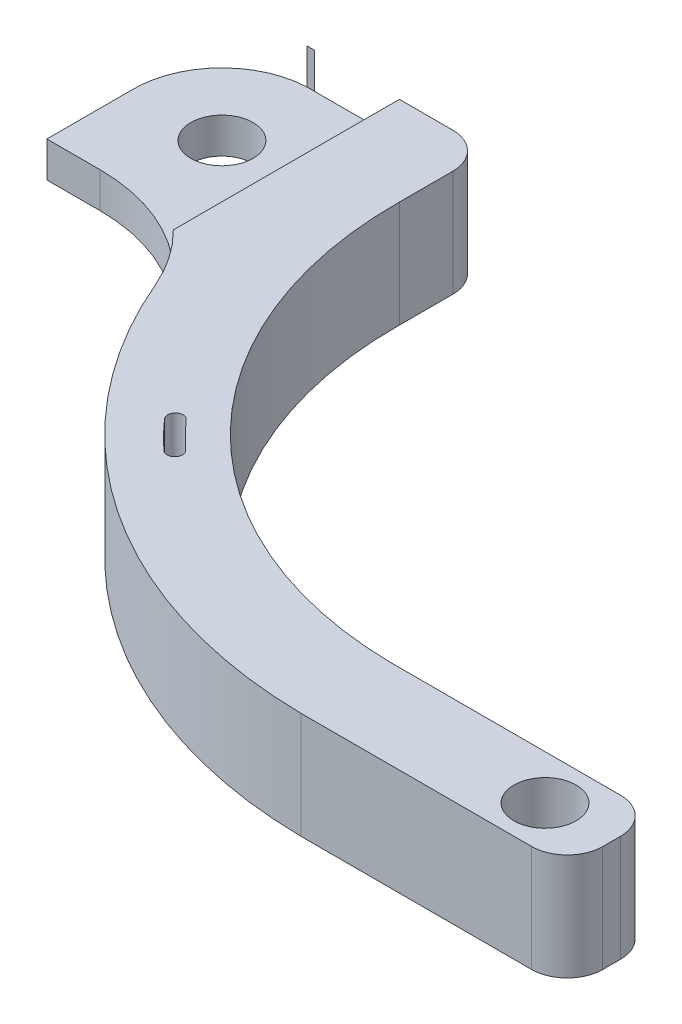
ISO-10303-21;
HEADER;
FILE_DESCRIPTION(('STEP AP214'),'2;1');
FILE_NAME('part.step','',(''),(''),'','','');
FILE_SCHEMA(('AUTOMOTIVE_DESIGN { 1 0 10303 214 1 1 1 1 }'));
ENDSEC;
DATA;
#1=APPLICATION_CONTEXT('core data for automotive mechanical design processes');
#2=APPLICATION_PROTOCOL_DEFINITION('international standard','automotive_design',2000,#1);
#3=PRODUCT_CONTEXT('',#1,'mechanical');
#4=PRODUCT('Part','Part','',(#3));
#5=PRODUCT_RELATED_PRODUCT_CATEGORY('part','',(#4));
#6=PRODUCT_DEFINITION_FORMATION('','',#4);
#7=PRODUCT_DEFINITION_CONTEXT('part definition',#1,'design');
#8=PRODUCT_DEFINITION('design','',#6,#7);
#9=PRODUCT_DEFINITION_SHAPE('','',#8);
#10=(LENGTH_UNIT() NAMED_UNIT(*) SI_UNIT(.MILLI.,.METRE.));
#11=(NAMED_UNIT(*) PLANE_ANGLE_UNIT() SI_UNIT($,.RADIAN.));
#12=(NAMED_UNIT(*) SI_UNIT($,.STERADIAN.) SOLID_ANGLE_UNIT());
#13=UNCERTAINTY_MEASURE_WITH_UNIT(LENGTH_MEASURE(1.E-05),#10,'distance_accuracy_value','');
#14=(GEOMETRIC_REPRESENTATION_CONTEXT(3) GLOBAL_UNCERTAINTY_ASSIGNED_CONTEXT((#13)) GLOBAL_UNIT_ASSIGNED_CONTEXT((#10,
#11,#12)) REPRESENTATION_CONTEXT('',''));
#15=CARTESIAN_POINT('',(0.,0.,0.));
#16=DIRECTION('',(0.,0.,1.));
#17=DIRECTION('',(1.,0.,0.));
#18=AXIS2_PLACEMENT_3D('',#15,#16,#17);
#19=CARTESIAN_POINT('',(-88.8917954966248,6.,-35.8519945979515));
#20=DIRECTION('',(0.,-1.,0.));
#21=DIRECTION('',(0.,0.,-1.));
#22=AXIS2_PLACEMENT_3D('',#19,#20,#21);
#23=PLANE('',#22);
#24=CARTESIAN_POINT('',(-82.6113558040947,6.,-15.9488478176797));
#25=DIRECTION('',(0.,1.,0.));
#26=DIRECTION('',(0.,0.,1.));
#27=AXIS2_PLACEMENT_3D('',#24,#25,#26);
#28=CIRCLE('',#27,0.432645340796582);
#29=CARTESIAN_POINT('',(-82.2892006902112,6.,-16.2376350637826));
#30=VERTEX_POINT('',#29);
#31=CARTESIAN_POINT('',(-82.9335109179782,6.,-15.6600605715768));
#32=VERTEX_POINT('',#31);
#33=EDGE_CURVE('E523',#30,#32,#28,.T.);
#34=ORIENTED_EDGE('',*,*,#33,.F.);
#35=CARTESIAN_POINT('',(-64.1975810991762,6.,-32.4553785484468));
#36=DIRECTION('',(0.,-1.,0.));
#37=DIRECTION('',(0.,0.,1.));
#38=AXIS2_PLACEMENT_3D('',#35,#36,#37);
#39=CIRCLE('',#38,24.2965409711154);
#40=CARTESIAN_POINT('',(-80.80721679802,6.,-14.7228687116306));
#41=VERTEX_POINT('',#40);
#42=EDGE_CURVE('E519',#41,#30,#39,.T.);
#43=ORIENTED_EDGE('',*,*,#42,.F.);
#44=CARTESIAN_POINT('',(-81.1029824177425,6.,-14.4071082183716));
#45=DIRECTION('',(0.,1.,0.));
#46=DIRECTION('',(0.,0.,1.));
#47=AXIS2_PLACEMENT_3D('',#44,#45,#46);
#48=CIRCLE('',#47,0.432645340796584);
#49=CARTESIAN_POINT('',(-81.3987480374649,6.,-14.0913477251125));
#50=VERTEX_POINT('',#49);
#51=EDGE_CURVE('E533',#50,#41,#48,.T.);
#52=ORIENTED_EDGE('',*,*,#51,.F.);
#53=CARTESIAN_POINT('',(-64.1975810991762,6.,-32.4553785484468));
#54=DIRECTION('',(0.,1.,0.));
#55=DIRECTION('',(0.,0.,1.));
#56=AXIS2_PLACEMENT_3D('',#53,#54,#55);
#57=CIRCLE('',#56,25.1618316527086);
#58=EDGE_CURVE('E536',#32,#50,#57,.T.);
#59=ORIENTED_EDGE('',*,*,#58,.F.);
#60=EDGE_LOOP('',(#34,#43,#52,#59));
#61=FACE_BOUND('',#60,.T.);
#62=CARTESIAN_POINT('',(-53.494759729002,6.,-7.64536322118409));
#63=DIRECTION('',(0.,1.,0.));
#64=DIRECTION('',(0.,0.,1.));
#65=AXIS2_PLACEMENT_3D('',#62,#63,#64);
#66=CIRCLE('',#65,1.75);
#67=CARTESIAN_POINT('',(-53.494759729002,6.,-5.89536322118409));
#68=VERTEX_POINT('',#67);
#69=EDGE_CURVE('E233',#68,#68,#66,.T.);
#70=ORIENTED_EDGE('',*,*,#69,.F.);
#71=EDGE_LOOP('',(#70));
#72=FACE_BOUND('',#71,.T.);
#73=DIRECTION('',(-1.,0.,0.));
#74=VECTOR('',#73,1.);
#75=CARTESIAN_POINT('',(-91.8917954966248,6.,-37.8519945979515));
#76=LINE('',#75,#74);
#77=CARTESIAN_POINT('',(-88.8917954966248,6.,-37.8519945979515));
#78=VERTEX_POINT('',#77);
#79=CARTESIAN_POINT('',(-91.8996439317029,6.,-37.8519945979515));
#80=VERTEX_POINT('',#79);
#81=EDGE_CURVE('E457',#78,#80,#76,.T.);
#82=ORIENTED_EDGE('',*,*,#81,.T.);
#83=DIRECTION('',(0.,0.,-1.));
#84=VECTOR('',#83,1.);
#85=CARTESIAN_POINT('',(-91.8996439317029,6.,-22.8519945979515));
#86=LINE('',#85,#84);
#87=CARTESIAN_POINT('',(-91.8996439317029,6.,-25.1228569150128));
#88=VERTEX_POINT('',#87);
#89=EDGE_CURVE('E212',#88,#80,#86,.T.);
#90=ORIENTED_EDGE('',*,*,#89,.F.);
#91=CARTESIAN_POINT('',(-98.9135695501476,6.,-17.9951049960047));
#92=DIRECTION('',(0.,-1.,0.));
#93=DIRECTION('',(0.,0.,1.));
#94=AXIS2_PLACEMENT_3D('',#91,#92,#93);
#95=CIRCLE('',#94,10.);
#96=CARTESIAN_POINT('',(-89.7080217050551,6.,-21.9012397698843));
#97=VERTEX_POINT('',#96);
#98=EDGE_CURVE('E461',#88,#97,#95,.T.);
#99=ORIENTED_EDGE('',*,*,#98,.T.);
#100=CARTESIAN_POINT('',(-64.3927651310505,6.,-32.6431103980532));
#101=DIRECTION('',(0.,1.,0.));
#102=DIRECTION('',(0.,0.,1.));
#103=AXIS2_PLACEMENT_3D('',#100,#101,#102);
#104=CIRCLE('',#103,27.5);
#105=CARTESIAN_POINT('',(-64.744759729002,6.,-5.14536322118409));
#106=VERTEX_POINT('',#105);
#107=EDGE_CURVE('E463',#97,#106,#104,.T.);
#108=ORIENTED_EDGE('',*,*,#107,.T.);
#109=DIRECTION('',(1.,0.,0.));
#110=VECTOR('',#109,1.);
#111=CARTESIAN_POINT('',(-64.744759729002,6.,-5.14536322118409));
#112=LINE('',#111,#110);
#113=CARTESIAN_POINT('',(-51.744759729002,6.,-5.14536322118409));
#114=VERTEX_POINT('',#113);
#115=EDGE_CURVE('E469',#106,#114,#112,.T.);
#116=ORIENTED_EDGE('',*,*,#115,.T.);
#117=CARTESIAN_POINT('',(-51.744759729002,6.,-7.14536322118409));
#118=DIRECTION('',(0.,1.,0.));
#119=DIRECTION('',(0.,0.,-1.));
#120=AXIS2_PLACEMENT_3D('',#117,#118,#119);
#121=CIRCLE('',#120,2.);
#122=CARTESIAN_POINT('',(-49.744759729002,6.,-7.14536322118409));
#123=VERTEX_POINT('',#122);
#124=EDGE_CURVE('E471',#114,#123,#121,.T.);
#125=ORIENTED_EDGE('',*,*,#124,.T.);
#126=DIRECTION('',(0.,0.,-1.));
#127=VECTOR('',#126,1.);
#128=CARTESIAN_POINT('',(-49.744759729002,6.,-8.14588401777568));
#129=LINE('',#128,#127);
#130=CARTESIAN_POINT('',(-49.744759729002,6.,-8.14588401777568));
#131=VERTEX_POINT('',#130);
#132=EDGE_CURVE('E473',#123,#131,#129,.T.);
#133=ORIENTED_EDGE('',*,*,#132,.T.);
#134=CARTESIAN_POINT('',(-51.744759729002,6.,-8.14588401777568));
#135=DIRECTION('',(0.,1.,0.));
#136=DIRECTION('',(0.,0.,1.));
#137=AXIS2_PLACEMENT_3D('',#134,#135,#136);
#138=CIRCLE('',#137,2.);
#139=CARTESIAN_POINT('',(-51.744759729002,6.,-10.1458840177757));
#140=VERTEX_POINT('',#139);
#141=EDGE_CURVE('E475',#131,#140,#138,.T.);
#142=ORIENTED_EDGE('',*,*,#141,.T.);
#143=DIRECTION('',(-1.,0.,0.));
#144=VECTOR('',#143,1.);
#145=CARTESIAN_POINT('',(-64.7460429177072,6.,-10.1458840177757));
#146=LINE('',#145,#144);
#147=CARTESIAN_POINT('',(-64.7460429177072,6.,-10.1458840177757));
#148=VERTEX_POINT('',#147);
#149=EDGE_CURVE('E477',#140,#148,#146,.T.);
#150=ORIENTED_EDGE('',*,*,#149,.T.);
#151=CARTESIAN_POINT('',(-64.3927651310505,6.,-32.6431103980532));
#152=DIRECTION('',(0.,-1.,0.));
#153=DIRECTION('',(0.,0.,1.));
#154=AXIS2_PLACEMENT_3D('',#151,#152,#153);
#155=CIRCLE('',#154,22.5);
#156=CARTESIAN_POINT('',(-86.8917954966248,6.,-32.8519945979515));
#157=VERTEX_POINT('',#156);
#158=EDGE_CURVE('E479',#148,#157,#155,.T.);
#159=ORIENTED_EDGE('',*,*,#158,.T.);
#160=DIRECTION('',(0.,0.,-1.));
#161=VECTOR('',#160,1.);
#162=CARTESIAN_POINT('',(-86.8917954966248,6.,-35.8519945979515));
#163=LINE('',#162,#161);
#164=CARTESIAN_POINT('',(-86.8917954966248,6.,-35.8519945979515));
#165=VERTEX_POINT('',#164);
#166=EDGE_CURVE('E257',#157,#165,#163,.T.);
#167=ORIENTED_EDGE('',*,*,#166,.T.);
#168=CARTESIAN_POINT('',(-88.8917954966248,6.,-35.8519945979515));
#169=DIRECTION('',(0.,1.,0.));
#170=DIRECTION('',(0.,0.,-1.));
#171=AXIS2_PLACEMENT_3D('',#168,#169,#170);
#172=CIRCLE('',#171,2.);
#173=EDGE_CURVE('E252',#165,#78,#172,.T.);
#174=ORIENTED_EDGE('',*,*,#173,.T.);
#175=EDGE_LOOP('',(#82,#90,#99,#108,#116,#125,#133,#142,#150,#159,#167,#174));
#176=FACE_BOUND('',#175,.T.);
#177=ADVANCED_FACE('F33',(#61,#72,#176),#23,.F.);
#178=CARTESIAN_POINT('',(-88.8917954966248,0.,-35.8519945979515));
#179=DIRECTION('',(0.,-1.,0.));
#180=DIRECTION('',(0.,0.,-1.));
#181=AXIS2_PLACEMENT_3D('',#178,#179,#180);
#182=PLANE('',#181);
#183=DIRECTION('',(0.,0.,-1.));
#184=VECTOR('',#183,1.);
#185=CARTESIAN_POINT('',(-91.8996439317029,0.,-22.8519945979515));
#186=LINE('',#185,#184);
#187=CARTESIAN_POINT('',(-91.8996439317029,0.,-25.1228569150128));
#188=VERTEX_POINT('',#187);
#189=CARTESIAN_POINT('',(-91.8996439317029,0.,-37.8519945979515));
#190=VERTEX_POINT('',#189);
#191=EDGE_CURVE('E206',#188,#190,#186,.T.);
#192=ORIENTED_EDGE('',*,*,#191,.T.);
#193=DIRECTION('',(-1.,0.,0.));
#194=VECTOR('',#193,1.);
#195=CARTESIAN_POINT('',(-96.6826595632696,0.,-37.8519945979515));
#196=LINE('',#195,#194);
#197=CARTESIAN_POINT('',(-88.8917954966248,0.,-37.8519945979515));
#198=VERTEX_POINT('',#197);
#199=EDGE_CURVE('E219',#198,#190,#196,.T.);
#200=ORIENTED_EDGE('',*,*,#199,.F.);
#201=CARTESIAN_POINT('',(-88.8917954966248,0.,-35.8519945979515));
#202=DIRECTION('',(0.,1.,0.));
#203=DIRECTION('',(0.,0.,-1.));
#204=AXIS2_PLACEMENT_3D('',#201,#202,#203);
#205=CIRCLE('',#204,2.);
#206=CARTESIAN_POINT('',(-86.8917954966248,0.,-35.8519945979515));
#207=VERTEX_POINT('',#206);
#208=EDGE_CURVE('E229',#207,#198,#205,.T.);
#209=ORIENTED_EDGE('',*,*,#208,.F.);
#210=DIRECTION('',(0.,0.,-1.));
#211=VECTOR('',#210,1.);
#212=CARTESIAN_POINT('',(-86.8917954966248,0.,-35.8519945979515));
#213=LINE('',#212,#211);
#214=CARTESIAN_POINT('',(-86.8917954966248,0.,-32.8519945979515));
#215=VERTEX_POINT('',#214);
#216=EDGE_CURVE('E250',#215,#207,#213,.T.);
#217=ORIENTED_EDGE('',*,*,#216,.F.);
#218=CARTESIAN_POINT('',(-64.3927651310505,0.,-32.6431103980532));
#219=DIRECTION('',(0.,-1.,0.));
#220=DIRECTION('',(0.,0.,1.));
#221=AXIS2_PLACEMENT_3D('',#218,#219,#220);
#222=CIRCLE('',#221,22.5);
#223=CARTESIAN_POINT('',(-64.7460429177072,0.,-10.1458840177757));
#224=VERTEX_POINT('',#223);
#225=EDGE_CURVE('E248',#224,#215,#222,.T.);
#226=ORIENTED_EDGE('',*,*,#225,.F.);
#227=DIRECTION('',(-1.,0.,0.));
#228=VECTOR('',#227,1.);
#229=CARTESIAN_POINT('',(-64.7460429177072,0.,-10.1458840177757));
#230=LINE('',#229,#228);
#231=CARTESIAN_POINT('',(-51.744759729002,0.,-10.1458840177757));
#232=VERTEX_POINT('',#231);
#233=EDGE_CURVE('E246',#232,#224,#230,.T.);
#234=ORIENTED_EDGE('',*,*,#233,.F.);
#235=CARTESIAN_POINT('',(-51.744759729002,0.,-8.14588401777568));
#236=DIRECTION('',(0.,1.,0.));
#237=DIRECTION('',(0.,0.,1.));
#238=AXIS2_PLACEMENT_3D('',#235,#236,#237);
#239=CIRCLE('',#238,2.);
#240=CARTESIAN_POINT('',(-49.744759729002,0.,-8.14588401777568));
#241=VERTEX_POINT('',#240);
#242=EDGE_CURVE('E244',#241,#232,#239,.T.);
#243=ORIENTED_EDGE('',*,*,#242,.F.);
#244=DIRECTION('',(0.,0.,-1.));
#245=VECTOR('',#244,1.);
#246=CARTESIAN_POINT('',(-49.744759729002,0.,-8.14588401777568));
#247=LINE('',#246,#245);
#248=CARTESIAN_POINT('',(-49.744759729002,0.,-7.14536322118409));
#249=VERTEX_POINT('',#248);
#250=EDGE_CURVE('E242',#249,#241,#247,.T.);
#251=ORIENTED_EDGE('',*,*,#250,.F.);
#252=CARTESIAN_POINT('',(-51.744759729002,0.,-7.14536322118409));
#253=DIRECTION('',(0.,1.,0.));
#254=DIRECTION('',(0.,0.,-1.));
#255=AXIS2_PLACEMENT_3D('',#252,#253,#254);
#256=CIRCLE('',#255,2.);
#257=CARTESIAN_POINT('',(-51.744759729002,0.,-5.14536322118409));
#258=VERTEX_POINT('',#257);
#259=EDGE_CURVE('E240',#258,#249,#256,.T.);
#260=ORIENTED_EDGE('',*,*,#259,.F.);
#261=DIRECTION('',(1.,0.,0.));
#262=VECTOR('',#261,1.);
#263=CARTESIAN_POINT('',(-64.744759729002,0.,-5.14536322118409));
#264=LINE('',#263,#262);
#265=CARTESIAN_POINT('',(-64.744759729002,0.,-5.14536322118409));
#266=VERTEX_POINT('',#265);
#267=EDGE_CURVE('E238',#266,#258,#264,.T.);
#268=ORIENTED_EDGE('',*,*,#267,.F.);
#269=CARTESIAN_POINT('',(-64.3927651310505,0.,-32.6431103980532));
#270=DIRECTION('',(0.,1.,0.));
#271=DIRECTION('',(0.,0.,1.));
#272=AXIS2_PLACEMENT_3D('',#269,#270,#271);
#273=CIRCLE('',#272,27.5);
#274=CARTESIAN_POINT('',(-89.7080217050551,0.,-21.9012397698843));
#275=VERTEX_POINT('',#274);
#276=EDGE_CURVE('E231',#275,#266,#273,.T.);
#277=ORIENTED_EDGE('',*,*,#276,.F.);
#278=CARTESIAN_POINT('',(-98.9135695501476,0.,-17.9951049960047));
#279=DIRECTION('',(0.,-1.,0.));
#280=DIRECTION('',(0.,0.,1.));
#281=AXIS2_PLACEMENT_3D('',#278,#279,#280);
#282=CIRCLE('',#281,10.);
#283=EDGE_CURVE('E222',#188,#275,#282,.T.);
#284=ORIENTED_EDGE('',*,*,#283,.F.);
#285=EDGE_LOOP('',(#192,#200,#209,#217,#226,#234,#243,#251,#260,#268,#277,#284));
#286=FACE_BOUND('',#285,.T.);
#287=CARTESIAN_POINT('',(-53.494759729002,0.,-7.64536322118409));
#288=DIRECTION('',(0.,1.,0.));
#289=DIRECTION('',(0.,0.,1.));
#290=AXIS2_PLACEMENT_3D('',#287,#288,#289);
#291=CIRCLE('',#290,1.75);
#292=CARTESIAN_POINT('',(-53.494759729002,0.,-5.89536322118409));
#293=VERTEX_POINT('',#292);
#294=EDGE_CURVE('E504',#293,#293,#291,.T.);
#295=ORIENTED_EDGE('',*,*,#294,.T.);
#296=EDGE_LOOP('',(#295));
#297=FACE_BOUND('',#296,.T.);
#298=CARTESIAN_POINT('',(-64.1975810991762,0.,-32.4553785484468));
#299=DIRECTION('',(0.,-1.,0.));
#300=DIRECTION('',(0.,0.,1.));
#301=AXIS2_PLACEMENT_3D('',#298,#299,#300);
#302=CIRCLE('',#301,24.2965409711154);
#303=CARTESIAN_POINT('',(-80.80721679802,0.,-14.7228687116306));
#304=VERTEX_POINT('',#303);
#305=CARTESIAN_POINT('',(-82.2892006902112,0.,-16.2376350637826));
#306=VERTEX_POINT('',#305);
#307=EDGE_CURVE('E520',#304,#306,#302,.T.);
#308=ORIENTED_EDGE('',*,*,#307,.T.);
#309=CARTESIAN_POINT('',(-82.6113558040947,0.,-15.9488478176797));
#310=DIRECTION('',(0.,1.,0.));
#311=DIRECTION('',(0.,0.,1.));
#312=AXIS2_PLACEMENT_3D('',#309,#310,#311);
#313=CIRCLE('',#312,0.432645340796582);
#314=CARTESIAN_POINT('',(-82.9335109179782,0.,-15.6600605715768));
#315=VERTEX_POINT('',#314);
#316=EDGE_CURVE('E347',#306,#315,#313,.T.);
#317=ORIENTED_EDGE('',*,*,#316,.T.);
#318=CARTESIAN_POINT('',(-64.1975810991762,0.,-32.4553785484468));
#319=DIRECTION('',(0.,1.,0.));
#320=DIRECTION('',(0.,0.,1.));
#321=AXIS2_PLACEMENT_3D('',#318,#319,#320);
#322=CIRCLE('',#321,25.1618316527086);
#323=CARTESIAN_POINT('',(-81.3987480374649,0.,-14.0913477251125));
#324=VERTEX_POINT('',#323);
#325=EDGE_CURVE('E527',#315,#324,#322,.T.);
#326=ORIENTED_EDGE('',*,*,#325,.T.);
#327=CARTESIAN_POINT('',(-81.1029824177425,0.,-14.4071082183716));
#328=DIRECTION('',(0.,1.,0.));
#329=DIRECTION('',(0.,0.,1.));
#330=AXIS2_PLACEMENT_3D('',#327,#328,#329);
#331=CIRCLE('',#330,0.432645340796584);
#332=EDGE_CURVE('E524',#324,#304,#331,.T.);
#333=ORIENTED_EDGE('',*,*,#332,.T.);
#334=EDGE_LOOP('',(#308,#317,#326,#333));
#335=FACE_BOUND('',#334,.T.);
#336=ADVANCED_FACE('F216',(#286,#297,#335),#182,.T.);
#337=CARTESIAN_POINT('',(-88.8917954966248,6.,-35.8519945979515));
#338=DIRECTION('',(0.,-1.,0.));
#339=DIRECTION('',(0.,0.,-1.));
#340=AXIS2_PLACEMENT_3D('',#337,#338,#339);
#341=CYLINDRICAL_SURFACE('',#340,2.);
#342=ORIENTED_EDGE('',*,*,#208,.T.);
#343=DIRECTION('',(0.,-1.,0.));
#344=VECTOR('',#343,1.);
#345=CARTESIAN_POINT('',(-88.8917954966248,6.,-37.8519945979515));
#346=LINE('',#345,#344);
#347=EDGE_CURVE('E227',#78,#198,#346,.T.);
#348=ORIENTED_EDGE('',*,*,#347,.F.);
#349=ORIENTED_EDGE('',*,*,#173,.F.);
#350=DIRECTION('',(0.,-1.,0.));
#351=VECTOR('',#350,1.);
#352=CARTESIAN_POINT('',(-86.8917954966248,6.,-35.8519945979515));
#353=LINE('',#352,#351);
#354=EDGE_CURVE('E253',#165,#207,#353,.T.);
#355=ORIENTED_EDGE('',*,*,#354,.T.);
#356=EDGE_LOOP('',(#342,#348,#349,#355));
#357=FACE_BOUND('',#356,.T.);
#358=ADVANCED_FACE('F35',(#357),#341,.T.);
#359=CARTESIAN_POINT('',(-96.6826595632696,6.,-37.8519945979515));
#360=DIRECTION('',(0.,0.,1.));
#361=DIRECTION('',(1.,0.,0.));
#362=AXIS2_PLACEMENT_3D('',#359,#360,#361);
#363=PLANE('',#362);
#364=ORIENTED_EDGE('',*,*,#199,.T.);
#365=DIRECTION('',(0.,-1.,0.));
#366=VECTOR('',#365,1.);
#367=CARTESIAN_POINT('',(-91.8996439317029,2.,-37.8519945979515));
#368=LINE('',#367,#366);
#369=CARTESIAN_POINT('',(-91.8996439317029,2.,-37.8519945979515));
#370=VERTEX_POINT('',#369);
#371=EDGE_CURVE('E203',#370,#190,#368,.T.);
#372=ORIENTED_EDGE('',*,*,#371,.F.);
#373=DIRECTION('',(1.,0.,0.));
#374=VECTOR('',#373,1.);
#375=CARTESIAN_POINT('',(-91.8996439317029,2.,-37.8519945979515));
#376=LINE('',#375,#374);
#377=CARTESIAN_POINT('',(-96.6826595632696,2.,-37.8519945979515));
#378=VERTEX_POINT('',#377);
#379=EDGE_CURVE('E363',#378,#370,#376,.T.);
#380=ORIENTED_EDGE('',*,*,#379,.F.);
#381=DIRECTION('',(0.,-1.,0.));
#382=VECTOR('',#381,1.);
#383=CARTESIAN_POINT('',(-96.6826595632696,6.,-37.8519945979515));
#384=LINE('',#383,#382);
#385=CARTESIAN_POINT('',(-96.6826595632696,4.,-37.8519945979515));
#386=VERTEX_POINT('',#385);
#387=EDGE_CURVE('E291',#386,#378,#384,.T.);
#388=ORIENTED_EDGE('',*,*,#387,.F.);
#389=DIRECTION('',(-1.,0.,0.));
#390=VECTOR('',#389,1.);
#391=CARTESIAN_POINT('',(-91.8996439317029,4.,-37.8519945979515));
#392=LINE('',#391,#390);
#393=CARTESIAN_POINT('',(-91.8996439317029,4.,-37.8519945979515));
#394=VERTEX_POINT('',#393);
#395=EDGE_CURVE('E314',#394,#386,#392,.T.);
#396=ORIENTED_EDGE('',*,*,#395,.F.);
#397=DIRECTION('',(0.,-1.,0.));
#398=VECTOR('',#397,1.);
#399=CARTESIAN_POINT('',(-91.8996439317029,6.,-37.8519945979515));
#400=LINE('',#399,#398);
#401=EDGE_CURVE('E322',#80,#394,#400,.T.);
#402=ORIENTED_EDGE('',*,*,#401,.F.);
#403=ORIENTED_EDGE('',*,*,#81,.F.);
#404=ORIENTED_EDGE('',*,*,#347,.T.);
#405=EDGE_LOOP('',(#364,#372,#380,#388,#396,#402,#403,#404));
#406=FACE_BOUND('',#405,.T.);
#407=ADVANCED_FACE('F225',(#406),#363,.F.);
#408=CARTESIAN_POINT('',(-96.8917954966248,6.,-32.8519945979515));
#409=DIRECTION('',(0.,-1.,0.));
#410=DIRECTION('',(0.,0.,-1.));
#411=AXIS2_PLACEMENT_3D('',#408,#409,#410);
#412=CYLINDRICAL_SURFACE('',#411,5.00437187253507);
#413=CARTESIAN_POINT('',(-96.8917954966248,2.,-32.8519945979515));
#414=DIRECTION('',(0.,1.,0.));
#415=DIRECTION('',(0.,0.,1.));
#416=AXIS2_PLACEMENT_3D('',#413,#414,#415);
#417=CIRCLE('',#416,5.00437187253507);
#418=CARTESIAN_POINT('',(-97.10093142998,2.,-37.8519945979515));
#419=VERTEX_POINT('',#418);
#420=CARTESIAN_POINT('',(-101.891795496625,2.,-32.6428586645962));
#421=VERTEX_POINT('',#420);
#422=EDGE_CURVE('E345',#419,#421,#417,.T.);
#423=ORIENTED_EDGE('',*,*,#422,.T.);
#424=DIRECTION('',(0.,-1.,0.));
#425=VECTOR('',#424,1.);
#426=CARTESIAN_POINT('',(-101.891795496625,6.,-32.6428586645962));
#427=LINE('',#426,#425);
#428=CARTESIAN_POINT('',(-101.891795496625,4.,-32.6428586645962));
#429=VERTEX_POINT('',#428);
#430=EDGE_CURVE('E287',#429,#421,#427,.T.);
#431=ORIENTED_EDGE('',*,*,#430,.F.);
#432=CARTESIAN_POINT('',(-96.8917954966248,4.,-32.8519945979515));
#433=DIRECTION('',(0.,-1.,0.));
#434=DIRECTION('',(0.,0.,-1.));
#435=AXIS2_PLACEMENT_3D('',#432,#433,#434);
#436=CIRCLE('',#435,5.00437187253507);
#437=CARTESIAN_POINT('',(-97.10093142998,4.,-37.8519945979515));
#438=VERTEX_POINT('',#437);
#439=EDGE_CURVE('E333',#429,#438,#436,.T.);
#440=ORIENTED_EDGE('',*,*,#439,.T.);
#441=DIRECTION('',(0.,-1.,0.));
#442=VECTOR('',#441,1.);
#443=CARTESIAN_POINT('',(-97.10093142998,6.,-37.8519945979515));
#444=LINE('',#443,#442);
#445=CARTESIAN_POINT('',(-97.10093142998,6.,-37.8519945979515));
#446=VERTEX_POINT('',#445);
#447=EDGE_CURVE('E44',#438,#446,#444,.F.);
#448=ORIENTED_EDGE('',*,*,#447,.T.);
#449=CARTESIAN_POINT('',(-96.8917954966248,6.,-32.8519945979515));
#450=DIRECTION('',(0.,-1.,0.));
#451=DIRECTION('',(-0.0417906459955494,0.,-0.999126389355859));
#452=AXIS2_PLACEMENT_3D('',#449,#450,#451);
#453=CIRCLE('',#452,5.00437187253507);
#454=CARTESIAN_POINT('',(-96.6826595632696,6.,-37.8519945979515));
#455=VERTEX_POINT('',#454);
#456=EDGE_CURVE('E308',#446,#455,#453,.T.);
#457=ORIENTED_EDGE('',*,*,#456,.T.);
#458=EDGE_CURVE('E295',#455,#386,#384,.T.);
#459=ORIENTED_EDGE('',*,*,#458,.T.);
#460=ORIENTED_EDGE('',*,*,#387,.T.);
#461=CARTESIAN_POINT('',(-96.6826595632696,0.,-37.8519945979515));
#462=VERTEX_POINT('',#461);
#463=EDGE_CURVE('E290',#378,#462,#384,.T.);
#464=ORIENTED_EDGE('',*,*,#463,.T.);
#465=CARTESIAN_POINT('',(-96.8917954966248,0.,-32.8519945979515));
#466=DIRECTION('',(0.,1.,0.));
#467=DIRECTION('',(0.0417906459955466,0.,-0.999126389355859));
#468=AXIS2_PLACEMENT_3D('',#465,#466,#467);
#469=CIRCLE('',#468,5.00437187253507);
#470=CARTESIAN_POINT('',(-97.10093142998,0.,-37.8519945979515));
#471=VERTEX_POINT('',#470);
#472=EDGE_CURVE('E211',#462,#471,#469,.T.);
#473=ORIENTED_EDGE('',*,*,#472,.T.);
#474=DIRECTION('',(0.,-1.,0.));
#475=VECTOR('',#474,1.);
#476=CARTESIAN_POINT('',(-97.10093142998,6.,-37.8519945979515));
#477=LINE('',#476,#475);
#478=EDGE_CURVE('E11',#471,#419,#477,.F.);
#479=ORIENTED_EDGE('',*,*,#478,.T.);
#480=EDGE_LOOP('',(#423,#431,#440,#448,#457,#459,#460,#464,#473,#479));
#481=FACE_BOUND('',#480,.T.);
#482=ADVANCED_FACE('F309',(#481),#412,.T.);
#483=CARTESIAN_POINT('',(-101.891795496625,6.,-32.6428586645962));
#484=DIRECTION('',(1.,0.,0.));
#485=DIRECTION('',(0.,0.,-1.));
#486=AXIS2_PLACEMENT_3D('',#483,#484,#485);
#487=PLANE('',#486);
#488=ORIENTED_EDGE('',*,*,#430,.T.);
#489=DIRECTION('',(0.,0.,1.));
#490=VECTOR('',#489,1.);
#491=CARTESIAN_POINT('',(-101.891795496625,2.,-32.6428586645962));
#492=LINE('',#491,#490);
#493=CARTESIAN_POINT('',(-101.891795496625,2.,-27.9951049960047));
#494=VERTEX_POINT('',#493);
#495=EDGE_CURVE('E342',#421,#494,#492,.T.);
#496=ORIENTED_EDGE('',*,*,#495,.T.);
#497=DIRECTION('',(0.,-1.,0.));
#498=VECTOR('',#497,1.);
#499=CARTESIAN_POINT('',(-101.891795496625,6.,-27.9951049960047));
#500=LINE('',#499,#498);
#501=CARTESIAN_POINT('',(-101.891795496625,4.,-27.9951049960047));
#502=VERTEX_POINT('',#501);
#503=EDGE_CURVE('E284',#502,#494,#500,.T.);
#504=ORIENTED_EDGE('',*,*,#503,.F.);
#505=DIRECTION('',(0.,0.,-1.));
#506=VECTOR('',#505,1.);
#507=CARTESIAN_POINT('',(-101.891795496625,4.,-32.6428586645962));
#508=LINE('',#507,#506);
#509=EDGE_CURVE('E330',#502,#429,#508,.T.);
#510=ORIENTED_EDGE('',*,*,#509,.T.);
#511=EDGE_LOOP('',(#488,#496,#504,#510));
#512=FACE_BOUND('',#511,.T.);
#513=ADVANCED_FACE('F378',(#512),#487,.F.);
#514=CARTESIAN_POINT('',(-101.891795496625,6.,-27.9951049960047));
#515=DIRECTION('',(0.,0.,-1.));
#516=DIRECTION('',(-1.,0.,0.));
#517=AXIS2_PLACEMENT_3D('',#514,#515,#516);
#518=PLANE('',#517);
#519=ORIENTED_EDGE('',*,*,#503,.T.);
#520=DIRECTION('',(1.,0.,0.));
#521=VECTOR('',#520,1.);
#522=CARTESIAN_POINT('',(-101.891795496625,2.,-27.9951049960047));
#523=LINE('',#522,#521);
#524=CARTESIAN_POINT('',(-98.9135695501476,2.,-27.9951049960047));
#525=VERTEX_POINT('',#524);
#526=EDGE_CURVE('E339',#494,#525,#523,.T.);
#527=ORIENTED_EDGE('',*,*,#526,.T.);
#528=DIRECTION('',(0.,-1.,0.));
#529=VECTOR('',#528,1.);
#530=CARTESIAN_POINT('',(-98.9135695501476,6.,-27.9951049960047));
#531=LINE('',#530,#529);
#532=CARTESIAN_POINT('',(-98.9135695501476,4.,-27.9951049960047));
#533=VERTEX_POINT('',#532);
#534=EDGE_CURVE('E281',#533,#525,#531,.T.);
#535=ORIENTED_EDGE('',*,*,#534,.F.);
#536=DIRECTION('',(-1.,0.,0.));
#537=VECTOR('',#536,1.);
#538=CARTESIAN_POINT('',(-101.891795496625,4.,-27.9951049960047));
#539=LINE('',#538,#537);
#540=EDGE_CURVE('E60',#533,#502,#539,.T.);
#541=ORIENTED_EDGE('',*,*,#540,.T.);
#542=EDGE_LOOP('',(#519,#527,#535,#541));
#543=FACE_BOUND('',#542,.T.);
#544=ADVANCED_FACE('F434',(#543),#518,.F.);
#545=CARTESIAN_POINT('',(-98.9135695501476,6.,-17.9951049960047));
#546=DIRECTION('',(0.,-1.,0.));
#547=DIRECTION('',(0.,0.,-1.));
#548=AXIS2_PLACEMENT_3D('',#545,#546,#547);
#549=CYLINDRICAL_SURFACE('',#548,10.);
#550=CARTESIAN_POINT('',(-98.9135695501476,2.,-17.9951049960047));
#551=DIRECTION('',(0.,1.,0.));
#552=DIRECTION('',(0.,0.,1.));
#553=AXIS2_PLACEMENT_3D('',#550,#551,#552);
#554=CIRCLE('',#553,10.);
#555=CARTESIAN_POINT('',(-91.8996439317029,2.,-25.1228569150128));
#556=VERTEX_POINT('',#555);
#557=EDGE_CURVE('E336',#525,#556,#554,.F.);
#558=ORIENTED_EDGE('',*,*,#557,.T.);
#559=DIRECTION('',(0.,-1.,0.));
#560=VECTOR('',#559,1.);
#561=CARTESIAN_POINT('',(-91.8996439317029,6.,-25.1228569150128));
#562=LINE('',#561,#560);
#563=EDGE_CURVE('E352',#556,#188,#562,.T.);
#564=ORIENTED_EDGE('',*,*,#563,.T.);
#565=ORIENTED_EDGE('',*,*,#283,.T.);
#566=DIRECTION('',(0.,-1.,0.));
#567=VECTOR('',#566,1.);
#568=CARTESIAN_POINT('',(-89.7080217050551,6.,-21.9012397698843));
#569=LINE('',#568,#567);
#570=EDGE_CURVE('E278',#97,#275,#569,.T.);
#571=ORIENTED_EDGE('',*,*,#570,.F.);
#572=ORIENTED_EDGE('',*,*,#98,.F.);
#573=DIRECTION('',(0.,-1.,0.));
#574=VECTOR('',#573,1.);
#575=CARTESIAN_POINT('',(-91.8996439317029,6.,-25.1228569150128));
#576=LINE('',#575,#574);
#577=CARTESIAN_POINT('',(-91.8996439317029,4.,-25.1228569150128));
#578=VERTEX_POINT('',#577);
#579=EDGE_CURVE('E354',#88,#578,#576,.T.);
#580=ORIENTED_EDGE('',*,*,#579,.T.);
#581=CARTESIAN_POINT('',(-98.9135695501476,4.,-17.9951049960047));
#582=DIRECTION('',(0.,-1.,0.));
#583=DIRECTION('',(0.,0.,-1.));
#584=AXIS2_PLACEMENT_3D('',#581,#582,#583);
#585=CIRCLE('',#584,10.);
#586=EDGE_CURVE('E326',#578,#533,#585,.F.);
#587=ORIENTED_EDGE('',*,*,#586,.T.);
#588=ORIENTED_EDGE('',*,*,#534,.T.);
#589=EDGE_LOOP('',(#558,#564,#565,#571,#572,#580,#587,#588));
#590=FACE_BOUND('',#589,.T.);
#591=ADVANCED_FACE('F431',(#590),#549,.F.);
#592=CARTESIAN_POINT('',(-64.3927651310505,6.,-32.6431103980532));
#593=DIRECTION('',(0.,-1.,0.));
#594=DIRECTION('',(0.,0.,-1.));
#595=AXIS2_PLACEMENT_3D('',#592,#593,#594);
#596=CYLINDRICAL_SURFACE('',#595,27.5);
#597=ORIENTED_EDGE('',*,*,#276,.T.);
#598=DIRECTION('',(0.,-1.,0.));
#599=VECTOR('',#598,1.);
#600=CARTESIAN_POINT('',(-64.744759729002,6.,-5.14536322118409));
#601=LINE('',#600,#599);
#602=EDGE_CURVE('E275',#106,#266,#601,.T.);
#603=ORIENTED_EDGE('',*,*,#602,.F.);
#604=ORIENTED_EDGE('',*,*,#107,.F.);
#605=ORIENTED_EDGE('',*,*,#570,.T.);
#606=EDGE_LOOP('',(#597,#603,#604,#605));
#607=FACE_BOUND('',#606,.T.);
#608=ADVANCED_FACE('F427',(#607),#596,.T.);
#609=CARTESIAN_POINT('',(-64.744759729002,6.,-5.14536322118409));
#610=DIRECTION('',(0.,0.,-1.));
#611=DIRECTION('',(-1.,0.,0.));
#612=AXIS2_PLACEMENT_3D('',#609,#610,#611);
#613=PLANE('',#612);
#614=ORIENTED_EDGE('',*,*,#267,.T.);
#615=DIRECTION('',(0.,-1.,0.));
#616=VECTOR('',#615,1.);
#617=CARTESIAN_POINT('',(-51.744759729002,6.,-5.14536322118409));
#618=LINE('',#617,#616);
#619=EDGE_CURVE('E272',#114,#258,#618,.T.);
#620=ORIENTED_EDGE('',*,*,#619,.F.);
#621=ORIENTED_EDGE('',*,*,#115,.F.);
#622=ORIENTED_EDGE('',*,*,#602,.T.);
#623=EDGE_LOOP('',(#614,#620,#621,#622));
#624=FACE_BOUND('',#623,.T.);
#625=ADVANCED_FACE('F423',(#624),#613,.F.);
#626=CARTESIAN_POINT('',(-51.744759729002,6.,-7.14536322118409));
#627=DIRECTION('',(0.,-1.,0.));
#628=DIRECTION('',(0.,0.,-1.));
#629=AXIS2_PLACEMENT_3D('',#626,#627,#628);
#630=CYLINDRICAL_SURFACE('',#629,2.);
#631=ORIENTED_EDGE('',*,*,#259,.T.);
#632=DIRECTION('',(0.,-1.,0.));
#633=VECTOR('',#632,1.);
#634=CARTESIAN_POINT('',(-49.744759729002,6.,-7.14536322118409));
#635=LINE('',#634,#633);
#636=EDGE_CURVE('E269',#123,#249,#635,.T.);
#637=ORIENTED_EDGE('',*,*,#636,.F.);
#638=ORIENTED_EDGE('',*,*,#124,.F.);
#639=ORIENTED_EDGE('',*,*,#619,.T.);
#640=EDGE_LOOP('',(#631,#637,#638,#639));
#641=FACE_BOUND('',#640,.T.);
#642=ADVANCED_FACE('F419',(#641),#630,.T.);
#643=CARTESIAN_POINT('',(-49.744759729002,6.,-8.14588401777568));
#644=DIRECTION('',(-1.,0.,0.));
#645=DIRECTION('',(0.,0.,1.));
#646=AXIS2_PLACEMENT_3D('',#643,#644,#645);
#647=PLANE('',#646);
#648=ORIENTED_EDGE('',*,*,#250,.T.);
#649=DIRECTION('',(0.,-1.,0.));
#650=VECTOR('',#649,1.);
#651=CARTESIAN_POINT('',(-49.744759729002,6.,-8.14588401777568));
#652=LINE('',#651,#650);
#653=EDGE_CURVE('E266',#131,#241,#652,.T.);
#654=ORIENTED_EDGE('',*,*,#653,.F.);
#655=ORIENTED_EDGE('',*,*,#132,.F.);
#656=ORIENTED_EDGE('',*,*,#636,.T.);
#657=EDGE_LOOP('',(#648,#654,#655,#656));
#658=FACE_BOUND('',#657,.T.);
#659=ADVANCED_FACE('F415',(#658),#647,.F.);
#660=CARTESIAN_POINT('',(-51.744759729002,6.,-8.14588401777568));
#661=DIRECTION('',(0.,-1.,0.));
#662=DIRECTION('',(0.,0.,-1.));
#663=AXIS2_PLACEMENT_3D('',#660,#661,#662);
#664=CYLINDRICAL_SURFACE('',#663,2.);
#665=ORIENTED_EDGE('',*,*,#242,.T.);
#666=DIRECTION('',(0.,-1.,0.));
#667=VECTOR('',#666,1.);
#668=CARTESIAN_POINT('',(-51.744759729002,6.,-10.1458840177757));
#669=LINE('',#668,#667);
#670=EDGE_CURVE('E263',#140,#232,#669,.T.);
#671=ORIENTED_EDGE('',*,*,#670,.F.);
#672=ORIENTED_EDGE('',*,*,#141,.F.);
#673=ORIENTED_EDGE('',*,*,#653,.T.);
#674=EDGE_LOOP('',(#665,#671,#672,#673));
#675=FACE_BOUND('',#674,.T.);
#676=ADVANCED_FACE('F411',(#675),#664,.T.);
#677=CARTESIAN_POINT('',(-64.7460429177072,6.,-10.1458840177757));
#678=DIRECTION('',(0.,0.,1.));
#679=DIRECTION('',(1.,0.,0.));
#680=AXIS2_PLACEMENT_3D('',#677,#678,#679);
#681=PLANE('',#680);
#682=ORIENTED_EDGE('',*,*,#233,.T.);
#683=DIRECTION('',(0.,-1.,0.));
#684=VECTOR('',#683,1.);
#685=CARTESIAN_POINT('',(-64.7460429177072,6.,-10.1458840177757));
#686=LINE('',#685,#684);
#687=EDGE_CURVE('E260',#148,#224,#686,.T.);
#688=ORIENTED_EDGE('',*,*,#687,.F.);
#689=ORIENTED_EDGE('',*,*,#149,.F.);
#690=ORIENTED_EDGE('',*,*,#670,.T.);
#691=EDGE_LOOP('',(#682,#688,#689,#690));
#692=FACE_BOUND('',#691,.T.);
#693=ADVANCED_FACE('F407',(#692),#681,.F.);
#694=CARTESIAN_POINT('',(-64.3927651310505,6.,-32.6431103980532));
#695=DIRECTION('',(0.,-1.,0.));
#696=DIRECTION('',(0.,0.,-1.));
#697=AXIS2_PLACEMENT_3D('',#694,#695,#696);
#698=CYLINDRICAL_SURFACE('',#697,22.5);
#699=ORIENTED_EDGE('',*,*,#225,.T.);
#700=DIRECTION('',(0.,-1.,0.));
#701=VECTOR('',#700,1.);
#702=CARTESIAN_POINT('',(-86.8917954966248,6.,-32.8519945979515));
#703=LINE('',#702,#701);
#704=EDGE_CURVE('E256',#157,#215,#703,.T.);
#705=ORIENTED_EDGE('',*,*,#704,.F.);
#706=ORIENTED_EDGE('',*,*,#158,.F.);
#707=ORIENTED_EDGE('',*,*,#687,.T.);
#708=EDGE_LOOP('',(#699,#705,#706,#707));
#709=FACE_BOUND('',#708,.T.);
#710=ADVANCED_FACE('F403',(#709),#698,.F.);
#711=CARTESIAN_POINT('',(-86.8917954966248,6.,-35.8519945979515));
#712=DIRECTION('',(-1.,0.,0.));
#713=DIRECTION('',(0.,0.,1.));
#714=AXIS2_PLACEMENT_3D('',#711,#712,#713);
#715=PLANE('',#714);
#716=ORIENTED_EDGE('',*,*,#216,.T.);
#717=ORIENTED_EDGE('',*,*,#354,.F.);
#718=ORIENTED_EDGE('',*,*,#166,.F.);
#719=ORIENTED_EDGE('',*,*,#704,.T.);
#720=EDGE_LOOP('',(#716,#717,#718,#719));
#721=FACE_BOUND('',#720,.T.);
#722=ADVANCED_FACE('F399',(#721),#715,.F.);
#723=CARTESIAN_POINT('',(-53.494759729002,6.,-7.64536322118409));
#724=DIRECTION('',(0.,-1.,0.));
#725=DIRECTION('',(0.,0.,-1.));
#726=AXIS2_PLACEMENT_3D('',#723,#724,#725);
#727=CYLINDRICAL_SURFACE('',#726,1.75);
#728=ORIENTED_EDGE('',*,*,#69,.T.);
#729=EDGE_LOOP('',(#728));
#730=FACE_BOUND('',#729,.T.);
#731=ORIENTED_EDGE('',*,*,#294,.F.);
#732=EDGE_LOOP('',(#731));
#733=FACE_BOUND('',#732,.T.);
#734=ADVANCED_FACE('F402',(#730,#733),#727,.F.);
#735=CARTESIAN_POINT('',(-82.6113558040947,6.,-15.9488478176797));
#736=DIRECTION('',(0.,-1.,0.));
#737=DIRECTION('',(0.,0.,-1.));
#738=AXIS2_PLACEMENT_3D('',#735,#736,#737);
#739=CYLINDRICAL_SURFACE('',#738,0.432645340796582);
#740=ORIENTED_EDGE('',*,*,#316,.F.);
#741=DIRECTION('',(0.,-1.,0.));
#742=VECTOR('',#741,1.);
#743=CARTESIAN_POINT('',(-82.2892006902112,6.,-16.2376350637826));
#744=LINE('',#743,#742);
#745=EDGE_CURVE('E516',#30,#306,#744,.T.);
#746=ORIENTED_EDGE('',*,*,#745,.F.);
#747=ORIENTED_EDGE('',*,*,#33,.T.);
#748=DIRECTION('',(0.,-1.,0.));
#749=VECTOR('',#748,1.);
#750=CARTESIAN_POINT('',(-82.9335109179782,6.,-15.6600605715768));
#751=LINE('',#750,#749);
#752=EDGE_CURVE('E507',#32,#315,#751,.T.);
#753=ORIENTED_EDGE('',*,*,#752,.T.);
#754=EDGE_LOOP('',(#740,#746,#747,#753));
#755=FACE_BOUND('',#754,.T.);
#756=ADVANCED_FACE('F569',(#755),#739,.F.);
#757=CARTESIAN_POINT('',(-64.1975810991762,6.,-32.4553785484468));
#758=DIRECTION('',(0.,-1.,0.));
#759=DIRECTION('',(0.,0.,-1.));
#760=AXIS2_PLACEMENT_3D('',#757,#758,#759);
#761=CYLINDRICAL_SURFACE('',#760,25.1618316527086);
#762=ORIENTED_EDGE('',*,*,#325,.F.);
#763=ORIENTED_EDGE('',*,*,#752,.F.);
#764=ORIENTED_EDGE('',*,*,#58,.T.);
#765=DIRECTION('',(0.,-1.,0.));
#766=VECTOR('',#765,1.);
#767=CARTESIAN_POINT('',(-81.3987480374649,6.,-14.0913477251125));
#768=LINE('',#767,#766);
#769=EDGE_CURVE('E512',#50,#324,#768,.T.);
#770=ORIENTED_EDGE('',*,*,#769,.T.);
#771=EDGE_LOOP('',(#762,#763,#764,#770));
#772=FACE_BOUND('',#771,.T.);
#773=ADVANCED_FACE('F565',(#772),#761,.F.);
#774=CARTESIAN_POINT('',(-81.1029824177425,6.,-14.4071082183716));
#775=DIRECTION('',(0.,-1.,0.));
#776=DIRECTION('',(0.,0.,-1.));
#777=AXIS2_PLACEMENT_3D('',#774,#775,#776);
#778=CYLINDRICAL_SURFACE('',#777,0.432645340796584);
#779=ORIENTED_EDGE('',*,*,#332,.F.);
#780=ORIENTED_EDGE('',*,*,#769,.F.);
#781=ORIENTED_EDGE('',*,*,#51,.T.);
#782=DIRECTION('',(0.,-1.,0.));
#783=VECTOR('',#782,1.);
#784=CARTESIAN_POINT('',(-80.80721679802,6.,-14.7228687116306));
#785=LINE('',#784,#783);
#786=EDGE_CURVE('E514',#41,#304,#785,.T.);
#787=ORIENTED_EDGE('',*,*,#786,.T.);
#788=EDGE_LOOP('',(#779,#780,#781,#787));
#789=FACE_BOUND('',#788,.T.);
#790=ADVANCED_FACE('F561',(#789),#778,.F.);
#791=CARTESIAN_POINT('',(-64.1975810991762,6.,-32.4553785484468));
#792=DIRECTION('',(0.,-1.,0.));
#793=DIRECTION('',(0.,0.,-1.));
#794=AXIS2_PLACEMENT_3D('',#791,#792,#793);
#795=CYLINDRICAL_SURFACE('',#794,24.2965409711154);
#796=ORIENTED_EDGE('',*,*,#307,.F.);
#797=ORIENTED_EDGE('',*,*,#786,.F.);
#798=ORIENTED_EDGE('',*,*,#42,.T.);
#799=ORIENTED_EDGE('',*,*,#745,.T.);
#800=EDGE_LOOP('',(#796,#797,#798,#799));
#801=FACE_BOUND('',#800,.T.);
#802=ADVANCED_FACE('F552',(#801),#795,.T.);
#803=CARTESIAN_POINT('',(0.,0.,-37.8519945979514));
#804=DIRECTION('',(0.,0.,-1.));
#805=DIRECTION('',(-1.,0.,0.));
#806=AXIS2_PLACEMENT_3D('',#803,#804,#805);
#807=PLANE('',#806);
#808=ORIENTED_EDGE('',*,*,#456,.F.);
#809=ORIENTED_EDGE('',*,*,#447,.F.);
#810=EDGE_CURVE('E317',#386,#438,#392,.T.);
#811=ORIENTED_EDGE('',*,*,#810,.F.);
#812=ORIENTED_EDGE('',*,*,#458,.F.);
#813=EDGE_LOOP('',(#808,#809,#811,#812));
#814=FACE_BOUND('',#813,.T.);
#815=ADVANCED_FACE('F542',(#814),#807,.F.);
#816=CARTESIAN_POINT('',(-91.8996439317029,6.,-22.8519945979515));
#817=DIRECTION('',(1.,0.,0.));
#818=DIRECTION('',(0.,0.,-1.));
#819=AXIS2_PLACEMENT_3D('',#816,#817,#818);
#820=PLANE('',#819);
#821=ORIENTED_EDGE('',*,*,#89,.T.);
#822=ORIENTED_EDGE('',*,*,#401,.T.);
#823=DIRECTION('',(0.,0.,-1.));
#824=VECTOR('',#823,1.);
#825=CARTESIAN_POINT('',(-91.8996439317029,4.,-22.8519945979515));
#826=LINE('',#825,#824);
#827=EDGE_CURVE('E313',#578,#394,#826,.T.);
#828=ORIENTED_EDGE('',*,*,#827,.F.);
#829=ORIENTED_EDGE('',*,*,#579,.F.);
#830=EDGE_LOOP('',(#821,#822,#828,#829));
#831=FACE_BOUND('',#830,.T.);
#832=ADVANCED_FACE('F453',(#831),#820,.F.);
#833=CARTESIAN_POINT('',(-91.8996439317029,4.,-22.8519945979515));
#834=DIRECTION('',(0.,-1.,0.));
#835=DIRECTION('',(0.,0.,-1.));
#836=AXIS2_PLACEMENT_3D('',#833,#834,#835);
#837=PLANE('',#836);
#838=CARTESIAN_POINT('',(-96.8917954966248,4.,-32.8519945979515));
#839=DIRECTION('',(0.,-1.,0.));
#840=DIRECTION('',(0.,0.,-1.));
#841=AXIS2_PLACEMENT_3D('',#838,#839,#840);
#842=CIRCLE('',#841,1.75);
#843=CARTESIAN_POINT('',(-96.8917954966248,4.,-34.6019945979515));
#844=VERTEX_POINT('',#843);
#845=EDGE_CURVE('E328',#844,#844,#842,.T.);
#846=ORIENTED_EDGE('',*,*,#845,.T.);
#847=EDGE_LOOP('',(#846));
#848=FACE_BOUND('',#847,.T.);
#849=ORIENTED_EDGE('',*,*,#439,.F.);
#850=ORIENTED_EDGE('',*,*,#509,.F.);
#851=ORIENTED_EDGE('',*,*,#540,.F.);
#852=ORIENTED_EDGE('',*,*,#586,.F.);
#853=ORIENTED_EDGE('',*,*,#827,.T.);
#854=ORIENTED_EDGE('',*,*,#395,.T.);
#855=ORIENTED_EDGE('',*,*,#810,.T.);
#856=EDGE_LOOP('',(#849,#850,#851,#852,#853,#854,#855));
#857=FACE_BOUND('',#856,.T.);
#858=ADVANCED_FACE('F450',(#848,#857),#837,.F.);
#859=CARTESIAN_POINT('',(0.,0.,-37.8519945979514));
#860=DIRECTION('',(0.,0.,-1.));
#861=DIRECTION('',(-1.,0.,0.));
#862=AXIS2_PLACEMENT_3D('',#859,#860,#861);
#863=PLANE('',#862);
#864=EDGE_CURVE('E223',#419,#378,#376,.T.);
#865=ORIENTED_EDGE('',*,*,#864,.F.);
#866=ORIENTED_EDGE('',*,*,#478,.F.);
#867=ORIENTED_EDGE('',*,*,#472,.F.);
#868=ORIENTED_EDGE('',*,*,#463,.F.);
#869=EDGE_LOOP('',(#865,#866,#867,#868));
#870=FACE_BOUND('',#869,.T.);
#871=ADVANCED_FACE('F556',(#870),#863,.F.);
#872=CARTESIAN_POINT('',(-91.8996439317029,2.,-22.8519945979515));
#873=DIRECTION('',(1.,0.,0.));
#874=DIRECTION('',(0.,0.,-1.));
#875=AXIS2_PLACEMENT_3D('',#872,#873,#874);
#876=PLANE('',#875);
#877=DIRECTION('',(0.,0.,-1.));
#878=VECTOR('',#877,1.);
#879=CARTESIAN_POINT('',(-91.8996439317029,2.,-22.8519945979515));
#880=LINE('',#879,#878);
#881=EDGE_CURVE('E52',#556,#370,#880,.T.);
#882=ORIENTED_EDGE('',*,*,#881,.T.);
#883=ORIENTED_EDGE('',*,*,#371,.T.);
#884=ORIENTED_EDGE('',*,*,#191,.F.);
#885=ORIENTED_EDGE('',*,*,#563,.F.);
#886=EDGE_LOOP('',(#882,#883,#884,#885));
#887=FACE_BOUND('',#886,.T.);
#888=ADVANCED_FACE('F205',(#887),#876,.F.);
#889=CARTESIAN_POINT('',(-91.8996439317029,2.,-22.8519945979515));
#890=DIRECTION('',(0.,1.,0.));
#891=DIRECTION('',(0.,0.,1.));
#892=AXIS2_PLACEMENT_3D('',#889,#890,#891);
#893=PLANE('',#892);
#894=CARTESIAN_POINT('',(-96.8917954966248,2.,-32.8519945979515));
#895=DIRECTION('',(0.,1.,0.));
#896=DIRECTION('',(0.,0.,1.));
#897=AXIS2_PLACEMENT_3D('',#894,#895,#896);
#898=CIRCLE('',#897,1.75);
#899=CARTESIAN_POINT('',(-96.8917954966248,2.,-31.1019945979515));
#900=VERTEX_POINT('',#899);
#901=EDGE_CURVE('E335',#900,#900,#898,.T.);
#902=ORIENTED_EDGE('',*,*,#901,.T.);
#903=EDGE_LOOP('',(#902));
#904=FACE_BOUND('',#903,.T.);
#905=ORIENTED_EDGE('',*,*,#864,.T.);
#906=ORIENTED_EDGE('',*,*,#379,.T.);
#907=ORIENTED_EDGE('',*,*,#881,.F.);
#908=ORIENTED_EDGE('',*,*,#557,.F.);
#909=ORIENTED_EDGE('',*,*,#526,.F.);
#910=ORIENTED_EDGE('',*,*,#495,.F.);
#911=ORIENTED_EDGE('',*,*,#422,.F.);
#912=EDGE_LOOP('',(#905,#906,#907,#908,#909,#910,#911));
#913=FACE_BOUND('',#912,.T.);
#914=ADVANCED_FACE('F446',(#904,#913),#893,.F.);
#915=CARTESIAN_POINT('',(-96.8917954966248,6.,-32.8519945979515));
#916=DIRECTION('',(0.,-1.,0.));
#917=DIRECTION('',(0.,0.,-1.));
#918=AXIS2_PLACEMENT_3D('',#915,#916,#917);
#919=CYLINDRICAL_SURFACE('',#918,1.75);
#920=ORIENTED_EDGE('',*,*,#901,.F.);
#921=EDGE_LOOP('',(#920));
#922=FACE_BOUND('',#921,.T.);
#923=ORIENTED_EDGE('',*,*,#845,.F.);
#924=EDGE_LOOP('',(#923));
#925=FACE_BOUND('',#924,.T.);
#926=ADVANCED_FACE('F396',(#922,#925),#919,.F.);
#927=CLOSED_SHELL('',(#177,#336,#358,#407,#482,#513,#544,#591,#608,#625,#642,#659,#676,#693,
#710,#722,#734,#756,#773,#790,#802,#815,#832,#858,#871,#888,#914,#926));
#928=MANIFOLD_SOLID_BREP('B2',#927);
#929=ADVANCED_BREP_SHAPE_REPRESENTATION('',(#18,#928),#14);
#930=SHAPE_DEFINITION_REPRESENTATION(#9,#929);
ENDSEC;
END-ISO-10303-21;
